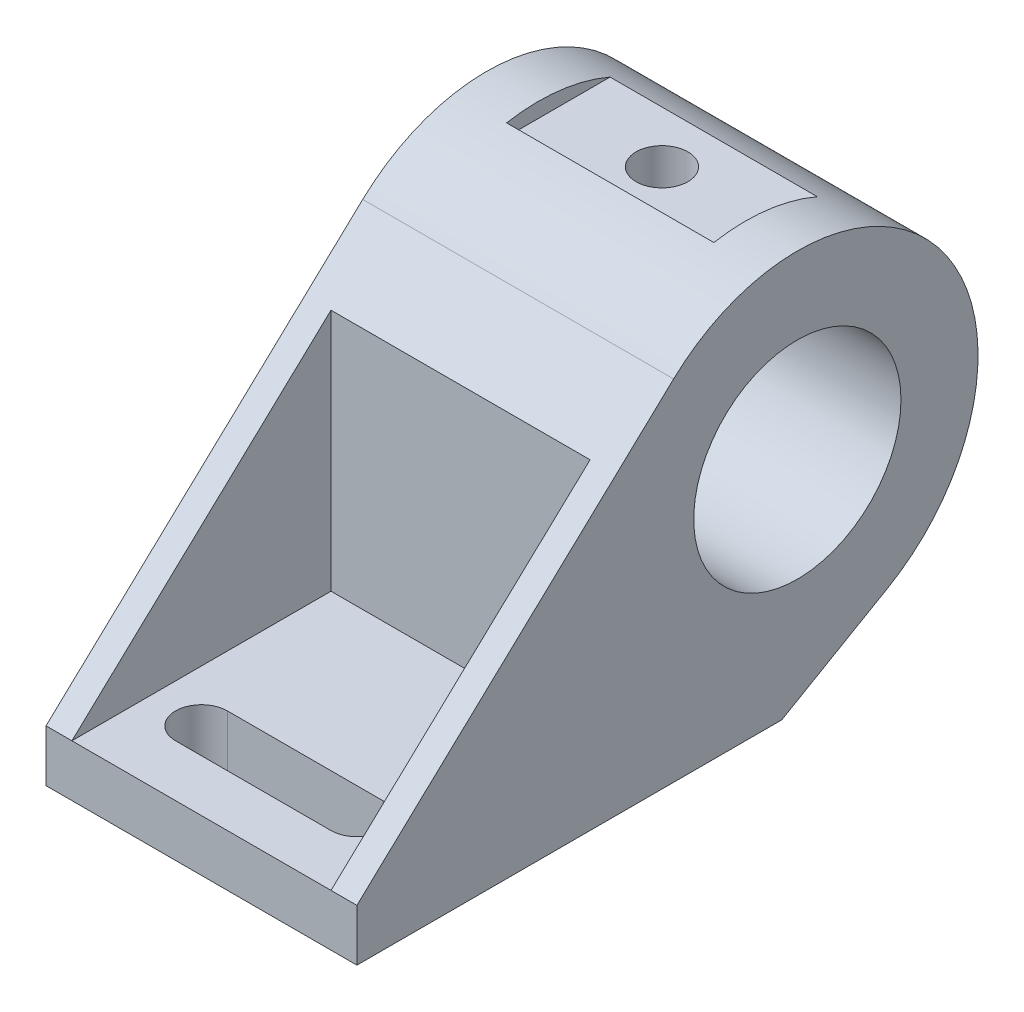
ISO-10303-21;
HEADER;
FILE_DESCRIPTION(('STEP AP214'),'2;1');
FILE_NAME('part.step','',(''),(''),'','','');
FILE_SCHEMA(('AUTOMOTIVE_DESIGN { 1 0 10303 214 1 1 1 1 }'));
ENDSEC;
DATA;
#1=APPLICATION_CONTEXT('core data for automotive mechanical design processes');
#2=APPLICATION_PROTOCOL_DEFINITION('international standard','automotive_design',2000,#1);
#3=PRODUCT_CONTEXT('',#1,'mechanical');
#4=PRODUCT('Part','Part','',(#3));
#5=PRODUCT_RELATED_PRODUCT_CATEGORY('part','',(#4));
#6=PRODUCT_DEFINITION_FORMATION('','',#4);
#7=PRODUCT_DEFINITION_CONTEXT('part definition',#1,'design');
#8=PRODUCT_DEFINITION('design','',#6,#7);
#9=PRODUCT_DEFINITION_SHAPE('','',#8);
#10=(LENGTH_UNIT() NAMED_UNIT(*) SI_UNIT(.MILLI.,.METRE.));
#11=(NAMED_UNIT(*) PLANE_ANGLE_UNIT() SI_UNIT($,.RADIAN.));
#12=(NAMED_UNIT(*) SI_UNIT($,.STERADIAN.) SOLID_ANGLE_UNIT());
#13=UNCERTAINTY_MEASURE_WITH_UNIT(LENGTH_MEASURE(1.E-05),#10,'distance_accuracy_value','');
#14=(GEOMETRIC_REPRESENTATION_CONTEXT(3) GLOBAL_UNCERTAINTY_ASSIGNED_CONTEXT((#13)) GLOBAL_UNIT_ASSIGNED_CONTEXT((#10,
#11,#12)) REPRESENTATION_CONTEXT('',''));
#15=CARTESIAN_POINT('',(0.,0.,0.));
#16=DIRECTION('',(0.,0.,1.));
#17=DIRECTION('',(1.,0.,0.));
#18=AXIS2_PLACEMENT_3D('',#15,#16,#17);
#19=CARTESIAN_POINT('',(30.,10.,41.));
#20=DIRECTION('',(-1.,0.,0.));
#21=DIRECTION('',(0.,0.,1.));
#22=AXIS2_PLACEMENT_3D('',#19,#20,#21);
#23=PLANE('',#22);
#24=DIRECTION('',(0.,0.,-1.));
#25=VECTOR('',#24,1.);
#26=CARTESIAN_POINT('',(30.,0.,41.));
#27=LINE('',#26,#25);
#28=CARTESIAN_POINT('',(30.,0.,41.));
#29=VERTEX_POINT('',#28);
#30=CARTESIAN_POINT('',(30.,0.,-41.));
#31=VERTEX_POINT('',#30);
#32=EDGE_CURVE('E244',#29,#31,#27,.T.);
#33=ORIENTED_EDGE('',*,*,#32,.T.);
#34=DIRECTION('',(0.,0.500000000000001,-0.866025403784438));
#35=VECTOR('',#34,1.);
#36=CARTESIAN_POINT('',(30.,-17.753520777581,-10.25));
#37=LINE('',#36,#35);
#38=CARTESIAN_POINT('',(30.,11.7990381056767,-61.4365334794732));
#39=VERTEX_POINT('',#38);
#40=EDGE_CURVE('E234',#31,#39,#37,.T.);
#41=ORIENTED_EDGE('',*,*,#40,.T.);
#42=CARTESIAN_POINT('',(30.,42.,-44.));
#43=DIRECTION('',(1.,0.,0.));
#44=DIRECTION('',(0.,0.,-1.));
#45=AXIS2_PLACEMENT_3D('',#42,#43,#44);
#46=CIRCLE('',#45,34.8730669589464);
#47=CARTESIAN_POINT('',(30.,67.4175118315234,-20.123633203154));
#48=VERTEX_POINT('',#47);
#49=EDGE_CURVE('E237',#39,#48,#46,.T.);
#50=ORIENTED_EDGE('',*,*,#49,.T.);
#51=DIRECTION('',(0.,0.684664954331488,-0.72885794247594));
#52=VECTOR('',#51,1.);
#53=CARTESIAN_POINT('',(30.,25.7723020889793,24.2096449862736));
#54=LINE('',#53,#52);
#55=CARTESIAN_POINT('',(30.,10.,41.));
#56=VERTEX_POINT('',#55);
#57=EDGE_CURVE('E223',#56,#48,#54,.T.);
#58=ORIENTED_EDGE('',*,*,#57,.F.);
#59=DIRECTION('',(0.,-1.,0.));
#60=VECTOR('',#59,1.);
#61=CARTESIAN_POINT('',(30.,10.,41.));
#62=LINE('',#61,#60);
#63=EDGE_CURVE('E249',#56,#29,#62,.T.);
#64=ORIENTED_EDGE('',*,*,#63,.T.);
#65=EDGE_LOOP('',(#33,#41,#50,#58,#64));
#66=FACE_BOUND('',#65,.T.);
#67=CARTESIAN_POINT('',(30.,42.,-44.));
#68=DIRECTION('',(1.,0.,0.));
#69=DIRECTION('',(0.,0.,-1.));
#70=AXIS2_PLACEMENT_3D('',#67,#68,#69);
#71=CIRCLE('',#70,20.);
#72=CARTESIAN_POINT('',(30.,42.,-64.));
#73=VERTEX_POINT('',#72);
#74=EDGE_CURVE('E216',#73,#73,#71,.T.);
#75=ORIENTED_EDGE('',*,*,#74,.F.);
#76=EDGE_LOOP('',(#75));
#77=FACE_BOUND('',#76,.T.);
#78=ADVANCED_FACE('F47',(#66,#77),#23,.F.);
#79=CARTESIAN_POINT('',(-30.,10.,41.));
#80=DIRECTION('',(1.,0.,0.));
#81=DIRECTION('',(0.,0.,-1.));
#82=AXIS2_PLACEMENT_3D('',#79,#80,#81);
#83=PLANE('',#82);
#84=DIRECTION('',(0.,0.500000000000001,-0.866025403784438));
#85=VECTOR('',#84,1.);
#86=CARTESIAN_POINT('',(-30.,-17.753520777581,-10.25));
#87=LINE('',#86,#85);
#88=CARTESIAN_POINT('',(-30.,0.,-41.));
#89=VERTEX_POINT('',#88);
#90=CARTESIAN_POINT('',(-30.,11.7990381056767,-61.4365334794732));
#91=VERTEX_POINT('',#90);
#92=EDGE_CURVE('E222',#89,#91,#87,.T.);
#93=ORIENTED_EDGE('',*,*,#92,.F.);
#94=DIRECTION('',(0.,0.,1.));
#95=VECTOR('',#94,1.);
#96=CARTESIAN_POINT('',(-30.,0.,41.));
#97=LINE('',#96,#95);
#98=CARTESIAN_POINT('',(-30.,0.,41.));
#99=VERTEX_POINT('',#98);
#100=EDGE_CURVE('E256',#89,#99,#97,.T.);
#101=ORIENTED_EDGE('',*,*,#100,.T.);
#102=DIRECTION('',(0.,-1.,0.));
#103=VECTOR('',#102,1.);
#104=CARTESIAN_POINT('',(-30.,10.,41.));
#105=LINE('',#104,#103);
#106=CARTESIAN_POINT('',(-30.,10.,41.));
#107=VERTEX_POINT('',#106);
#108=EDGE_CURVE('E262',#107,#99,#105,.T.);
#109=ORIENTED_EDGE('',*,*,#108,.F.);
#110=DIRECTION('',(0.,0.684664954331488,-0.72885794247594));
#111=VECTOR('',#110,1.);
#112=CARTESIAN_POINT('',(-30.,25.7723020889793,24.2096449862736));
#113=LINE('',#112,#111);
#114=CARTESIAN_POINT('',(-30.,67.4175118315234,-20.123633203154));
#115=VERTEX_POINT('',#114);
#116=EDGE_CURVE('E229',#107,#115,#113,.T.);
#117=ORIENTED_EDGE('',*,*,#116,.T.);
#118=CARTESIAN_POINT('',(-30.,42.,-44.));
#119=DIRECTION('',(1.,0.,0.));
#120=DIRECTION('',(0.,0.,-1.));
#121=AXIS2_PLACEMENT_3D('',#118,#119,#120);
#122=CIRCLE('',#121,34.8730669589464);
#123=EDGE_CURVE('E226',#91,#115,#122,.T.);
#124=ORIENTED_EDGE('',*,*,#123,.F.);
#125=EDGE_LOOP('',(#93,#101,#109,#117,#124));
#126=FACE_BOUND('',#125,.T.);
#127=CARTESIAN_POINT('',(-30.,42.,-44.));
#128=DIRECTION('',(1.,0.,0.));
#129=DIRECTION('',(0.,0.,-1.));
#130=AXIS2_PLACEMENT_3D('',#127,#128,#129);
#131=CIRCLE('',#130,20.);
#132=CARTESIAN_POINT('',(-30.,42.,-64.));
#133=VERTEX_POINT('',#132);
#134=EDGE_CURVE('E219',#133,#133,#131,.T.);
#135=ORIENTED_EDGE('',*,*,#134,.T.);
#136=EDGE_LOOP('',(#135));
#137=FACE_BOUND('',#136,.T.);
#138=ADVANCED_FACE('F297',(#126,#137),#83,.F.);
#139=CARTESIAN_POINT('',(-30.,10.,41.));
#140=DIRECTION('',(0.,0.,-1.));
#141=DIRECTION('',(-1.,0.,0.));
#142=AXIS2_PLACEMENT_3D('',#139,#140,#141);
#143=PLANE('',#142);
#144=DIRECTION('',(1.,0.,0.));
#145=VECTOR('',#144,1.);
#146=CARTESIAN_POINT('',(-30.,0.,41.));
#147=LINE('',#146,#145);
#148=EDGE_CURVE('E258',#99,#29,#147,.T.);
#149=ORIENTED_EDGE('',*,*,#148,.T.);
#150=ORIENTED_EDGE('',*,*,#63,.F.);
#151=DIRECTION('',(1.,0.,0.));
#152=VECTOR('',#151,1.);
#153=CARTESIAN_POINT('',(-30.,10.,41.));
#154=LINE('',#153,#152);
#155=CARTESIAN_POINT('',(25.,9.99999999999999,41.));
#156=VERTEX_POINT('',#155);
#157=EDGE_CURVE('E250',#156,#56,#154,.T.);
#158=ORIENTED_EDGE('',*,*,#157,.F.);
#159=DIRECTION('',(1.,0.,0.));
#160=VECTOR('',#159,1.);
#161=CARTESIAN_POINT('',(-25.,9.99999999999999,41.));
#162=LINE('',#161,#160);
#163=CARTESIAN_POINT('',(-25.,10.,41.));
#164=VERTEX_POINT('',#163);
#165=EDGE_CURVE('E203',#164,#156,#162,.T.);
#166=ORIENTED_EDGE('',*,*,#165,.F.);
#167=EDGE_CURVE('E246',#107,#164,#154,.T.);
#168=ORIENTED_EDGE('',*,*,#167,.F.);
#169=ORIENTED_EDGE('',*,*,#108,.T.);
#170=EDGE_LOOP('',(#149,#150,#158,#166,#168,#169));
#171=FACE_BOUND('',#170,.T.);
#172=ADVANCED_FACE('F309',(#171),#143,.F.);
#173=CARTESIAN_POINT('',(0.,0.,0.));
#174=DIRECTION('',(0.,-1.,0.));
#175=DIRECTION('',(0.,0.,-1.));
#176=AXIS2_PLACEMENT_3D('',#173,#174,#175);
#177=PLANE('',#176);
#178=CARTESIAN_POINT('',(-15.,0.,26.));
#179=DIRECTION('',(0.,-1.,0.));
#180=DIRECTION('',(0.,0.,-1.));
#181=AXIS2_PLACEMENT_3D('',#178,#179,#180);
#182=CIRCLE('',#181,5.);
#183=CARTESIAN_POINT('',(-15.,0.,31.));
#184=VERTEX_POINT('',#183);
#185=CARTESIAN_POINT('',(-15.,0.,21.));
#186=VERTEX_POINT('',#185);
#187=EDGE_CURVE('E199',#184,#186,#182,.T.);
#188=ORIENTED_EDGE('',*,*,#187,.F.);
#189=DIRECTION('',(-1.,0.,0.));
#190=VECTOR('',#189,1.);
#191=CARTESIAN_POINT('',(0.,0.,31.));
#192=LINE('',#191,#190);
#193=CARTESIAN_POINT('',(15.,0.,31.));
#194=VERTEX_POINT('',#193);
#195=EDGE_CURVE('E188',#194,#184,#192,.T.);
#196=ORIENTED_EDGE('',*,*,#195,.F.);
#197=CARTESIAN_POINT('',(15.,0.,26.));
#198=DIRECTION('',(0.,-1.,0.));
#199=DIRECTION('',(0.,0.,-1.));
#200=AXIS2_PLACEMENT_3D('',#197,#198,#199);
#201=CIRCLE('',#200,5.);
#202=CARTESIAN_POINT('',(15.,0.,21.));
#203=VERTEX_POINT('',#202);
#204=EDGE_CURVE('E195',#203,#194,#201,.T.);
#205=ORIENTED_EDGE('',*,*,#204,.F.);
#206=DIRECTION('',(1.,0.,0.));
#207=VECTOR('',#206,1.);
#208=CARTESIAN_POINT('',(0.,0.,21.));
#209=LINE('',#208,#207);
#210=EDGE_CURVE('E197',#186,#203,#209,.T.);
#211=ORIENTED_EDGE('',*,*,#210,.F.);
#212=EDGE_LOOP('',(#188,#196,#205,#211));
#213=FACE_BOUND('',#212,.T.);
#214=ORIENTED_EDGE('',*,*,#32,.F.);
#215=ORIENTED_EDGE('',*,*,#148,.F.);
#216=ORIENTED_EDGE('',*,*,#100,.F.);
#217=DIRECTION('',(-1.,0.,0.));
#218=VECTOR('',#217,1.);
#219=CARTESIAN_POINT('',(-30.,0.,-41.));
#220=LINE('',#219,#218);
#221=EDGE_CURVE('E253',#31,#89,#220,.T.);
#222=ORIENTED_EDGE('',*,*,#221,.F.);
#223=EDGE_LOOP('',(#214,#215,#216,#222));
#224=FACE_BOUND('',#223,.T.);
#225=ADVANCED_FACE('F308',(#213,#224),#177,.T.);
#226=CARTESIAN_POINT('',(-30.,-17.753520777581,-10.25));
#227=DIRECTION('',(0.,-0.866025403784438,-0.500000000000001));
#228=DIRECTION('',(0.,0.500000000000001,-0.866025403784438));
#229=AXIS2_PLACEMENT_3D('',#226,#227,#228);
#230=PLANE('',#229);
#231=ORIENTED_EDGE('',*,*,#40,.F.);
#232=ORIENTED_EDGE('',*,*,#221,.T.);
#233=ORIENTED_EDGE('',*,*,#92,.T.);
#234=DIRECTION('',(1.,0.,0.));
#235=VECTOR('',#234,1.);
#236=CARTESIAN_POINT('',(-30.,11.7990381056767,-61.4365334794732));
#237=LINE('',#236,#235);
#238=EDGE_CURVE('E231',#91,#39,#237,.T.);
#239=ORIENTED_EDGE('',*,*,#238,.T.);
#240=EDGE_LOOP('',(#231,#232,#233,#239));
#241=FACE_BOUND('',#240,.T.);
#242=ADVANCED_FACE('F294',(#241),#230,.T.);
#243=CARTESIAN_POINT('',(-30.,25.7723020889793,24.2096449862736));
#244=DIRECTION('',(0.,-0.72885794247594,-0.684664954331488));
#245=DIRECTION('',(0.,0.684664954331488,-0.72885794247594));
#246=AXIS2_PLACEMENT_3D('',#243,#244,#245);
#247=PLANE('',#246);
#248=ORIENTED_EDGE('',*,*,#167,.T.);
#249=DIRECTION('',(0.,0.684664954331488,-0.72885794247594));
#250=VECTOR('',#249,1.);
#251=CARTESIAN_POINT('',(-25.,25.7723020889793,24.2096449862736));
#252=LINE('',#251,#250);
#253=CARTESIAN_POINT('',(-25.,56.9683400859756,-8.99999999999999));
#254=VERTEX_POINT('',#253);
#255=EDGE_CURVE('E271',#164,#254,#252,.T.);
#256=ORIENTED_EDGE('',*,*,#255,.T.);
#257=DIRECTION('',(1.,0.,0.));
#258=VECTOR('',#257,1.);
#259=CARTESIAN_POINT('',(-30.,56.9683400859756,-8.99999999999999));
#260=LINE('',#259,#258);
#261=CARTESIAN_POINT('',(25.,56.9683400859756,-9.));
#262=VERTEX_POINT('',#261);
#263=EDGE_CURVE('E268',#254,#262,#260,.T.);
#264=ORIENTED_EDGE('',*,*,#263,.T.);
#265=DIRECTION('',(0.,-0.684664954331488,0.72885794247594));
#266=VECTOR('',#265,1.);
#267=CARTESIAN_POINT('',(25.,25.7723020889793,24.2096449862736));
#268=LINE('',#267,#266);
#269=EDGE_CURVE('E265',#262,#156,#268,.T.);
#270=ORIENTED_EDGE('',*,*,#269,.T.);
#271=ORIENTED_EDGE('',*,*,#157,.T.);
#272=ORIENTED_EDGE('',*,*,#57,.T.);
#273=DIRECTION('',(1.,0.,0.));
#274=VECTOR('',#273,1.);
#275=CARTESIAN_POINT('',(-30.,67.4175118315234,-20.123633203154));
#276=LINE('',#275,#274);
#277=EDGE_CURVE('E242',#115,#48,#276,.T.);
#278=ORIENTED_EDGE('',*,*,#277,.F.);
#279=ORIENTED_EDGE('',*,*,#116,.F.);
#280=EDGE_LOOP('',(#248,#256,#264,#270,#271,#272,#278,#279));
#281=FACE_BOUND('',#280,.T.);
#282=ADVANCED_FACE('F302',(#281),#247,.F.);
#283=CARTESIAN_POINT('',(-30.,42.,-44.));
#284=DIRECTION('',(1.,0.,0.));
#285=DIRECTION('',(0.,0.,-1.));
#286=AXIS2_PLACEMENT_3D('',#283,#284,#285);
#287=CYLINDRICAL_SURFACE('',#286,20.);
#288=CARTESIAN_POINT('',(0.,61.9683250672799,-42.8748360086451));
#289=CARTESIAN_POINT('',(-0.280919694586238,61.9683292922809,-42.8748477461033));
#290=CARTESIAN_POINT('',(-0.56194644347248,61.9697064901629,-42.8985814912696));
#291=CARTESIAN_POINT('',(-1.11610694894183,61.974681142184,-42.9928890215304));
#292=CARTESIAN_POINT('',(-1.3892362600569,61.9782798222711,-43.0634886716806));
#293=CARTESIAN_POINT('',(-1.9197024590713,61.9861294059561,-43.2495036027304));
#294=CARTESIAN_POINT('',(-2.1770435562266,61.9903801346459,-43.364906877993));
#295=CARTESIAN_POINT('',(-2.66870580102368,61.9971722319961,-43.6372676019227));
#296=CARTESIAN_POINT('',(-2.90302890547328,61.9997137460681,-43.7942215140841));
#297=CARTESIAN_POINT('',(-3.34201308666248,62.0002404366171,-44.1452360043947));
#298=CARTESIAN_POINT('',(-3.54667562628035,61.998225837886,-44.3392947514137));
#299=CARTESIAN_POINT('',(-3.92043423322227,61.9866961738599,-44.7588909395678));
#300=CARTESIAN_POINT('',(-4.08953328833862,61.9771817389672,-44.9844257336576));
#301=CARTESIAN_POINT('',(-4.38572483543892,61.9481988083931,-45.4577036887874));
#302=CARTESIAN_POINT('',(-4.51323880014234,61.9288356277117,-45.7051894643062));
#303=CARTESIAN_POINT('',(-4.72521350459567,61.8784230090553,-46.2168202094046));
#304=CARTESIAN_POINT('',(-4.80967892888781,61.84737484328,-46.4809633628114));
#305=CARTESIAN_POINT('',(-4.93305616667046,61.7732535713669,-47.0150181302385));
#306=CARTESIAN_POINT('',(-4.97244046038295,61.7303111580782,-47.2848391524793));
#307=CARTESIAN_POINT('',(-5.00707979156628,61.6327152411535,-47.8251645533715));
#308=CARTESIAN_POINT('',(-5.00233118595594,61.5780607710749,-48.0956689865943));
#309=CARTESIAN_POINT('',(-4.94942410800721,61.4574786090304,-48.6351208924258));
#310=CARTESIAN_POINT('',(-4.90045962609845,61.3913600944823,-48.9039457603308));
#311=CARTESIAN_POINT('',(-4.76033080405764,61.2511933078777,-49.4281918011179));
#312=CARTESIAN_POINT('',(-4.66915571501867,61.1771430196935,-49.6836095414263));
#313=CARTESIAN_POINT('',(-4.44200864370298,61.0206989951972,-50.1875754810561));
#314=CARTESIAN_POINT('',(-4.30402781657038,60.9380732932638,-50.4351444380977));
#315=CARTESIAN_POINT('',(-3.98827113276267,60.7723733137816,-50.9036042553462));
#316=CARTESIAN_POINT('',(-3.81048044040516,60.6892988802992,-51.1244851225088));
#317=CARTESIAN_POINT('',(-3.51369992415176,60.5669706047181,-51.4350974403566));
#318=CARTESIAN_POINT('',(-3.40765121542898,60.525888366053,-51.5367428948975));
#319=CARTESIAN_POINT('',(-3.18658518329725,60.4458153872069,-51.7306446224658));
#320=CARTESIAN_POINT('',(-3.07157152670624,60.4068238028127,-51.8229046990506));
#321=CARTESIAN_POINT('',(-2.83318374977257,60.3317173109674,-51.9973227596824));
#322=CARTESIAN_POINT('',(-2.70980687845297,60.2956033586594,-52.0794773944115));
#323=CARTESIAN_POINT('',(-2.45553411794996,60.2270967329699,-52.232860819967));
#324=CARTESIAN_POINT('',(-2.32464210276513,60.194702167655,-52.3040951718292));
#325=CARTESIAN_POINT('',(-2.06154481419465,60.1356253734181,-52.4323115130328));
#326=CARTESIAN_POINT('',(-1.92960177687741,60.1087664086265,-52.4897498239741));
#327=CARTESIAN_POINT('',(-1.6605259810246,60.0598824912574,-52.5932486469921));
#328=CARTESIAN_POINT('',(-1.52339584312814,60.0378551348994,-52.6393148182765));
#329=CARTESIAN_POINT('',(-1.24501474322583,59.9992236433569,-52.7195144373643));
#330=CARTESIAN_POINT('',(-1.10376591594106,59.9826167513127,-52.7536539517144));
#331=CARTESIAN_POINT('',(-0.818283946504251,59.9552922399774,-52.8095660645177));
#332=CARTESIAN_POINT('',(-0.67405110802272,59.9445740244492,-52.8313399150198));
#333=CARTESIAN_POINT('',(-0.397953641916834,59.9300848633288,-52.8607163110656));
#334=CARTESIAN_POINT('',(-0.266241787236023,59.9257423185065,-52.8694856640827));
#335=CARTESIAN_POINT('',(-0.00242033572544825,59.9222320920147,-52.8765767349342));
#336=CARTESIAN_POINT('',(0.129689377024214,59.9230661020266,-52.8748950373986));
#337=CARTESIAN_POINT('',(0.393154171427112,59.9298905797869,-52.8610993574272));
#338=CARTESIAN_POINT('',(0.52450962521629,59.9358782361575,-52.8489910628272));
#339=CARTESIAN_POINT('',(0.785582560367472,59.9528574621053,-52.8144924550511));
#340=CARTESIAN_POINT('',(0.915299407620375,59.9638509113313,-52.7920982795533));
#341=CARTESIAN_POINT('',(1.16675996456796,59.9900187267278,-52.7384253814807));
#342=CARTESIAN_POINT('',(1.28861098265388,60.0050003386463,-52.7075545956068));
#343=CARTESIAN_POINT('',(1.5291473035783,60.038989421876,-52.6369200906038));
#344=CARTESIAN_POINT('',(1.64783149358301,60.0579982879347,-52.5971532902758));
#345=CARTESIAN_POINT('',(1.99801327198691,60.120498397402,-52.465050640507));
#346=CARTESIAN_POINT('',(2.22383351827508,60.1694841594188,-52.359870697001));
#347=CARTESIAN_POINT('',(2.66812585233637,60.2817467504781,-52.1115535629738));
#348=CARTESIAN_POINT('',(2.88536041673466,60.3457006857397,-51.9665296494234));
#349=CARTESIAN_POINT('',(3.29327293074907,60.4815853627652,-51.6459974449823));
#350=CARTESIAN_POINT('',(3.48393945837622,60.5535195116159,-51.4704761152207));
#351=CARTESIAN_POINT('',(3.85163008600774,60.7079135895737,-51.0755181526871));
#352=CARTESIAN_POINT('',(4.02575217709649,60.7907311704098,-50.8535191317706));
#353=CARTESIAN_POINT('',(4.33448696125783,60.9556907170243,-50.3830829469453));
#354=CARTESIAN_POINT('',(4.46908798410432,61.0378324762928,-50.1346380032363));
#355=CARTESIAN_POINT('',(4.64072363168229,61.1586157271782,-49.7417217126361));
#356=CARTESIAN_POINT('',(4.69358407009145,61.1992186111869,-49.6045591615034));
#357=CARTESIAN_POINT('',(4.7871540473876,61.2784535565569,-49.3256167104914));
#358=CARTESIAN_POINT('',(4.82786827768456,61.3170863740537,-49.1838386168708));
#359=CARTESIAN_POINT('',(4.89671751486405,61.3918911109522,-48.8965910405033));
#360=CARTESIAN_POINT('',(4.92484941218868,61.4280624201541,-48.7511206546313));
#361=CARTESIAN_POINT('',(4.96813120589652,61.4974916508449,-48.4576382345063));
#362=CARTESIAN_POINT('',(4.98328705822254,61.5307509026543,-48.3096273981643));
#363=CARTESIAN_POINT('',(5.00004488755237,61.5929499282167,-48.0172003063504));
#364=CARTESIAN_POINT('',(5.00208909183094,61.6219979381202,-47.8728323766091));
#365=CARTESIAN_POINT('',(4.99361933552148,61.6768204563143,-47.5839010105749));
#366=CARTESIAN_POINT('',(4.98311071462308,61.7025963513306,-47.4393376835208));
#367=CARTESIAN_POINT('',(4.94947316128659,61.7507414760871,-47.1511201367449));
#368=CARTESIAN_POINT('',(4.92634488683399,61.7731108833629,-47.0074658700201));
#369=CARTESIAN_POINT('',(4.86751935276058,61.8143916551845,-46.7222498961141));
#370=CARTESIAN_POINT('',(4.83182256543074,61.8333031496289,-46.5806881105114));
#371=CARTESIAN_POINT('',(4.75014252594316,61.8668491443321,-46.3078655568873));
#372=CARTESIAN_POINT('',(4.70476381571701,61.8816503836181,-46.1764439148557));
#373=CARTESIAN_POINT('',(4.60307712427121,61.9082898302356,-45.9175343191328));
#374=CARTESIAN_POINT('',(4.54676542529788,61.9201270265027,-45.7900477206895));
#375=CARTESIAN_POINT('',(4.4236185608616,61.9410085364325,-45.5400981744359));
#376=CARTESIAN_POINT('',(4.35678817398937,61.9500541128168,-45.4176329771175));
#377=CARTESIAN_POINT('',(4.21301963790648,61.9656045456201,-45.1785553572989));
#378=CARTESIAN_POINT('',(4.13607775437966,61.9721084598241,-45.0619451192141));
#379=CARTESIAN_POINT('',(3.97391394128143,61.982779196778,-44.8372534726308));
#380=CARTESIAN_POINT('',(3.88883800915406,61.986980515848,-44.7290682655522));
#381=CARTESIAN_POINT('',(3.70999536446503,61.9935123005523,-44.5200090587535));
#382=CARTESIAN_POINT('',(3.61622550219497,61.9958420851742,-44.4191377325372));
#383=CARTESIAN_POINT('',(3.42069437928011,61.9989633846449,-44.2254826605596));
#384=CARTESIAN_POINT('',(3.31893482838198,61.9997552276758,-44.1326971933902));
#385=CARTESIAN_POINT('',(3.10807204256588,62.000146872888,-43.9558011093988));
#386=CARTESIAN_POINT('',(2.99896612775128,61.9997462377345,-43.8716936869043));
#387=CARTESIAN_POINT('',(2.77284976622854,61.9980854536707,-43.7118198724221));
#388=CARTESIAN_POINT('',(2.65576052601911,61.9968151044266,-43.6361650003566));
#389=CARTESIAN_POINT('',(2.41563598907421,61.9937449875375,-43.4948680645359));
#390=CARTESIAN_POINT('',(2.29259835714523,61.9919450105398,-43.4292299758524));
#391=CARTESIAN_POINT('',(2.04157069219043,61.9881336697413,-43.3085066956631));
#392=CARTESIAN_POINT('',(1.91358480619255,61.9861224806264,-43.2534128881714));
#393=CARTESIAN_POINT('',(1.65345532193551,61.9821641448841,-43.1540846105262));
#394=CARTESIAN_POINT('',(1.52131066360242,61.9802170148484,-43.1098529348486));
#395=CARTESIAN_POINT('',(1.16245875150588,61.9754031296101,-43.0062149131858));
#396=CARTESIAN_POINT('',(0.932702834351882,61.9728144289628,-42.9570217843133));
#397=CARTESIAN_POINT('',(0.468656115126311,61.9692736354783,-42.8913274377793));
#398=CARTESIAN_POINT('',(0.234365313579633,61.9683215424516,-42.8748262163339));
#399=CARTESIAN_POINT('',(0.,61.9683250672799,-42.8748360086451));
#400=B_SPLINE_CURVE_WITH_KNOTS('',3,(#288,#289,#290,#291,#292,#293,#294,#295,#296,#297,#298,
#299,#300,#301,#302,#303,#304,#305,#306,#307,#308,#309,#310,#311,#312,#313,#314,#315,#316,#317,
#318,#319,#320,#321,#322,#323,#324,#325,#326,#327,#328,#329,#330,#331,#332,#333,#334,#335,#336,
#337,#338,#339,#340,#341,#342,#343,#344,#345,#346,#347,#348,#349,#350,#351,#352,#353,#354,#355,
#356,#357,#358,#359,#360,#361,#362,#363,#364,#365,#366,#367,#368,#369,#370,#371,#372,#373,#374,
#375,#376,#377,#378,#379,#380,#381,#382,#383,#384,#385,#386,#387,#388,#389,#390,#391,#392,#393,
#394,#395,#396,#397,#398,#399),.UNSPECIFIED.,.T.,.F.,(4,2,2,2,2,2,2,2,2,2,2,2,2,2,2,2,2,2,2,2,2,
2,2,2,2,2,2,2,2,2,2,2,2,2,2,2,2,2,2,2,2,2,2,2,2,2,2,2,2,2,2,2,2,2,2,4),(0.,0.84194848268131,
1.68436201921408,2.52654997716245,3.36866627687389,4.21074102871898,5.05274500711695,
5.88592880842309,6.71902192329745,7.54330133606527,8.36764879202846,9.20733347477377,
10.0472321004553,10.9290535912705,11.8112042532937,12.2683300245441,12.7252697948313,
13.1823606061412,13.6392178701056,14.0777900490427,14.5161435358797,14.9542737265203,
15.3923595476651,15.7880803954117,16.1839305702649,16.579564940725,16.9753479924736,
17.3546817498965,17.734147096291,18.4924875570387,19.2959680599431,20.0997929321369,
20.9781143714438,21.8566949111565,22.3137239860913,22.770576306684,23.2275414700099,
23.6842967758876,24.1255619451233,24.5666394768995,25.0076940132044,25.4487319776326,
25.8676869606429,26.2867846592598,26.705692510395,27.1247555070833,27.5373556015849,
27.950105764728,28.3627678412297,28.7755812778831,29.1933212083521,29.6112264865136,
30.0287888124713,30.4464584514596,31.1488782062995,31.8512978798369),.UNSPECIFIED.);
#401=CARTESIAN_POINT('',(0.,61.9683250672799,-42.8748360086451));
#402=VERTEX_POINT('',#401);
#403=EDGE_CURVE('E646',#402,#402,#400,.T.);
#404=ORIENTED_EDGE('',*,*,#403,.F.);
#405=EDGE_LOOP('',(#404));
#406=FACE_BOUND('',#405,.T.);
#407=ORIENTED_EDGE('',*,*,#134,.F.);
#408=EDGE_LOOP('',(#407));
#409=FACE_BOUND('',#408,.T.);
#410=ORIENTED_EDGE('',*,*,#74,.T.);
#411=EDGE_LOOP('',(#410));
#412=FACE_BOUND('',#411,.T.);
#413=ADVANCED_FACE('F283',(#406,#409,#412),#287,.F.);
#414=CARTESIAN_POINT('',(-30.,42.,-44.));
#415=DIRECTION('',(1.,0.,0.));
#416=DIRECTION('',(0.,0.,-1.));
#417=AXIS2_PLACEMENT_3D('',#414,#415,#416);
#418=CYLINDRICAL_SURFACE('',#417,34.8730669589464);
#419=CARTESIAN_POINT('',(20.,42.,-44.));
#420=DIRECTION('',(1.,0.,0.));
#421=DIRECTION('',(0.,0.,-1.));
#422=AXIS2_PLACEMENT_3D('',#419,#420,#421);
#423=CIRCLE('',#422,34.8730669589464);
#424=CARTESIAN_POINT('',(20.,76.333379325291,-37.8885465534918));
#425=VERTEX_POINT('',#424);
#426=CARTESIAN_POINT('',(20.,74.,-57.8611254637984));
#427=VERTEX_POINT('',#426);
#428=EDGE_CURVE('E11',#425,#427,#423,.F.);
#429=ORIENTED_EDGE('',*,*,#428,.F.);
#430=DIRECTION('',(1.,0.,0.));
#431=VECTOR('',#430,1.);
#432=CARTESIAN_POINT('',(-30.,76.333379325291,-37.8885465534918));
#433=LINE('',#432,#431);
#434=CARTESIAN_POINT('',(-20.,76.333379325291,-37.8885465534918));
#435=VERTEX_POINT('',#434);
#436=EDGE_CURVE('E54',#435,#425,#433,.T.);
#437=ORIENTED_EDGE('',*,*,#436,.F.);
#438=CARTESIAN_POINT('',(-20.,42.,-44.));
#439=DIRECTION('',(-1.,0.,0.));
#440=DIRECTION('',(0.,0.,1.));
#441=AXIS2_PLACEMENT_3D('',#438,#439,#440);
#442=CIRCLE('',#441,34.8730669589464);
#443=CARTESIAN_POINT('',(-20.,74.,-57.8611254637984));
#444=VERTEX_POINT('',#443);
#445=EDGE_CURVE('E164',#444,#435,#442,.F.);
#446=ORIENTED_EDGE('',*,*,#445,.F.);
#447=DIRECTION('',(1.,0.,0.));
#448=VECTOR('',#447,1.);
#449=CARTESIAN_POINT('',(-30.,74.,-57.8611254637984));
#450=LINE('',#449,#448);
#451=EDGE_CURVE('E157',#427,#444,#450,.F.);
#452=ORIENTED_EDGE('',*,*,#451,.F.);
#453=EDGE_LOOP('',(#429,#437,#446,#452));
#454=FACE_BOUND('',#453,.T.);
#455=ORIENTED_EDGE('',*,*,#49,.F.);
#456=ORIENTED_EDGE('',*,*,#238,.F.);
#457=ORIENTED_EDGE('',*,*,#123,.T.);
#458=ORIENTED_EDGE('',*,*,#277,.T.);
#459=EDGE_LOOP('',(#455,#456,#457,#458));
#460=FACE_BOUND('',#459,.T.);
#461=ADVANCED_FACE('F279',(#454,#460),#418,.T.);
#462=CARTESIAN_POINT('',(-25.,9.99999999999999,41.));
#463=DIRECTION('',(-1.,0.,0.));
#464=DIRECTION('',(0.,0.,1.));
#465=AXIS2_PLACEMENT_3D('',#462,#463,#464);
#466=PLANE('',#465);
#467=DIRECTION('',(0.,0.,1.));
#468=VECTOR('',#467,1.);
#469=CARTESIAN_POINT('',(-25.,9.99999999999999,41.));
#470=LINE('',#469,#468);
#471=CARTESIAN_POINT('',(-25.,9.99999999999999,-8.99999999999999));
#472=VERTEX_POINT('',#471);
#473=EDGE_CURVE('E201',#472,#164,#470,.T.);
#474=ORIENTED_EDGE('',*,*,#473,.F.);
#475=DIRECTION('',(0.,1.,0.));
#476=VECTOR('',#475,1.);
#477=CARTESIAN_POINT('',(-25.,9.99999999999999,-8.99999999999999));
#478=LINE('',#477,#476);
#479=EDGE_CURVE('E213',#472,#254,#478,.T.);
#480=ORIENTED_EDGE('',*,*,#479,.T.);
#481=ORIENTED_EDGE('',*,*,#255,.F.);
#482=EDGE_LOOP('',(#474,#480,#481));
#483=FACE_BOUND('',#482,.T.);
#484=ADVANCED_FACE('F282',(#483),#466,.F.);
#485=CARTESIAN_POINT('',(-25.,9.99999999999999,-8.99999999999999));
#486=DIRECTION('',(0.,0.,-1.));
#487=DIRECTION('',(-1.,0.,0.));
#488=AXIS2_PLACEMENT_3D('',#485,#486,#487);
#489=PLANE('',#488);
#490=ORIENTED_EDGE('',*,*,#479,.F.);
#491=DIRECTION('',(-1.,0.,0.));
#492=VECTOR('',#491,1.);
#493=CARTESIAN_POINT('',(-25.,9.99999999999999,-8.99999999999999));
#494=LINE('',#493,#492);
#495=CARTESIAN_POINT('',(25.,9.99999999999999,-8.99999999999999));
#496=VERTEX_POINT('',#495);
#497=EDGE_CURVE('E209',#496,#472,#494,.T.);
#498=ORIENTED_EDGE('',*,*,#497,.F.);
#499=DIRECTION('',(0.,1.,0.));
#500=VECTOR('',#499,1.);
#501=CARTESIAN_POINT('',(25.,9.99999999999999,-8.99999999999999));
#502=LINE('',#501,#500);
#503=EDGE_CURVE('E212',#496,#262,#502,.T.);
#504=ORIENTED_EDGE('',*,*,#503,.T.);
#505=ORIENTED_EDGE('',*,*,#263,.F.);
#506=EDGE_LOOP('',(#490,#498,#504,#505));
#507=FACE_BOUND('',#506,.T.);
#508=ADVANCED_FACE('F316',(#507),#489,.F.);
#509=CARTESIAN_POINT('',(25.,9.99999999999999,41.));
#510=DIRECTION('',(1.,0.,0.));
#511=DIRECTION('',(0.,0.,-1.));
#512=AXIS2_PLACEMENT_3D('',#509,#510,#511);
#513=PLANE('',#512);
#514=ORIENTED_EDGE('',*,*,#503,.F.);
#515=DIRECTION('',(0.,0.,-1.));
#516=VECTOR('',#515,1.);
#517=CARTESIAN_POINT('',(25.,9.99999999999999,41.));
#518=LINE('',#517,#516);
#519=EDGE_CURVE('E206',#156,#496,#518,.T.);
#520=ORIENTED_EDGE('',*,*,#519,.F.);
#521=ORIENTED_EDGE('',*,*,#269,.F.);
#522=EDGE_LOOP('',(#514,#520,#521));
#523=FACE_BOUND('',#522,.T.);
#524=ADVANCED_FACE('F318',(#523),#513,.F.);
#525=CARTESIAN_POINT('',(0.,9.99999999999999,0.));
#526=DIRECTION('',(0.,-1.,0.));
#527=DIRECTION('',(0.,0.,-1.));
#528=AXIS2_PLACEMENT_3D('',#525,#526,#527);
#529=PLANE('',#528);
#530=DIRECTION('',(1.,0.,0.));
#531=VECTOR('',#530,1.);
#532=CARTESIAN_POINT('',(-15.,9.99999999999999,31.));
#533=LINE('',#532,#531);
#534=CARTESIAN_POINT('',(-15.,9.99999999999999,31.));
#535=VERTEX_POINT('',#534);
#536=CARTESIAN_POINT('',(15.,9.99999999999999,31.));
#537=VERTEX_POINT('',#536);
#538=EDGE_CURVE('E177',#535,#537,#533,.T.);
#539=ORIENTED_EDGE('',*,*,#538,.F.);
#540=CARTESIAN_POINT('',(-15.,9.99999999999999,26.));
#541=DIRECTION('',(0.,1.,0.));
#542=DIRECTION('',(0.,0.,1.));
#543=AXIS2_PLACEMENT_3D('',#540,#541,#542);
#544=CIRCLE('',#543,5.);
#545=CARTESIAN_POINT('',(-15.,9.99999999999999,21.));
#546=VERTEX_POINT('',#545);
#547=EDGE_CURVE('E174',#546,#535,#544,.T.);
#548=ORIENTED_EDGE('',*,*,#547,.F.);
#549=DIRECTION('',(-1.,0.,0.));
#550=VECTOR('',#549,1.);
#551=CARTESIAN_POINT('',(-15.,9.99999999999999,21.));
#552=LINE('',#551,#550);
#553=CARTESIAN_POINT('',(15.,9.99999999999999,21.));
#554=VERTEX_POINT('',#553);
#555=EDGE_CURVE('E182',#554,#546,#552,.T.);
#556=ORIENTED_EDGE('',*,*,#555,.F.);
#557=CARTESIAN_POINT('',(15.,9.99999999999999,26.));
#558=DIRECTION('',(0.,1.,0.));
#559=DIRECTION('',(0.,0.,1.));
#560=AXIS2_PLACEMENT_3D('',#557,#558,#559);
#561=CIRCLE('',#560,5.);
#562=EDGE_CURVE('E179',#537,#554,#561,.T.);
#563=ORIENTED_EDGE('',*,*,#562,.F.);
#564=EDGE_LOOP('',(#539,#548,#556,#563));
#565=FACE_BOUND('',#564,.T.);
#566=ORIENTED_EDGE('',*,*,#473,.T.);
#567=ORIENTED_EDGE('',*,*,#165,.T.);
#568=ORIENTED_EDGE('',*,*,#519,.T.);
#569=ORIENTED_EDGE('',*,*,#497,.T.);
#570=EDGE_LOOP('',(#566,#567,#568,#569));
#571=FACE_BOUND('',#570,.T.);
#572=ADVANCED_FACE('F320',(#565,#571),#529,.F.);
#573=CARTESIAN_POINT('',(-15.,-40.,26.));
#574=DIRECTION('',(0.,1.,0.));
#575=DIRECTION('',(0.,0.,1.));
#576=AXIS2_PLACEMENT_3D('',#573,#574,#575);
#577=CYLINDRICAL_SURFACE('',#576,5.);
#578=ORIENTED_EDGE('',*,*,#187,.T.);
#579=DIRECTION('',(0.,1.,0.));
#580=VECTOR('',#579,1.);
#581=CARTESIAN_POINT('',(-15.,-40.,21.));
#582=LINE('',#581,#580);
#583=EDGE_CURVE('E186',#186,#546,#582,.T.);
#584=ORIENTED_EDGE('',*,*,#583,.T.);
#585=ORIENTED_EDGE('',*,*,#547,.T.);
#586=DIRECTION('',(0.,1.,0.));
#587=VECTOR('',#586,1.);
#588=CARTESIAN_POINT('',(-15.,-40.,31.));
#589=LINE('',#588,#587);
#590=EDGE_CURVE('E185',#184,#535,#589,.T.);
#591=ORIENTED_EDGE('',*,*,#590,.F.);
#592=EDGE_LOOP('',(#578,#584,#585,#591));
#593=FACE_BOUND('',#592,.T.);
#594=ADVANCED_FACE('F322',(#593),#577,.F.);
#595=CARTESIAN_POINT('',(-15.,-40.,21.));
#596=DIRECTION('',(0.,0.,-1.));
#597=DIRECTION('',(-1.,0.,0.));
#598=AXIS2_PLACEMENT_3D('',#595,#596,#597);
#599=PLANE('',#598);
#600=ORIENTED_EDGE('',*,*,#210,.T.);
#601=DIRECTION('',(0.,1.,0.));
#602=VECTOR('',#601,1.);
#603=CARTESIAN_POINT('',(15.,-40.,21.));
#604=LINE('',#603,#602);
#605=EDGE_CURVE('E189',#203,#554,#604,.T.);
#606=ORIENTED_EDGE('',*,*,#605,.T.);
#607=ORIENTED_EDGE('',*,*,#555,.T.);
#608=ORIENTED_EDGE('',*,*,#583,.F.);
#609=EDGE_LOOP('',(#600,#606,#607,#608));
#610=FACE_BOUND('',#609,.T.);
#611=ADVANCED_FACE('F329',(#610),#599,.F.);
#612=CARTESIAN_POINT('',(15.,-40.,26.));
#613=DIRECTION('',(0.,1.,0.));
#614=DIRECTION('',(0.,0.,1.));
#615=AXIS2_PLACEMENT_3D('',#612,#613,#614);
#616=CYLINDRICAL_SURFACE('',#615,5.);
#617=ORIENTED_EDGE('',*,*,#204,.T.);
#618=DIRECTION('',(0.,1.,0.));
#619=VECTOR('',#618,1.);
#620=CARTESIAN_POINT('',(15.,-40.,31.));
#621=LINE('',#620,#619);
#622=EDGE_CURVE('E68',#194,#537,#621,.T.);
#623=ORIENTED_EDGE('',*,*,#622,.T.);
#624=ORIENTED_EDGE('',*,*,#562,.T.);
#625=ORIENTED_EDGE('',*,*,#605,.F.);
#626=EDGE_LOOP('',(#617,#623,#624,#625));
#627=FACE_BOUND('',#626,.T.);
#628=ADVANCED_FACE('F383',(#627),#616,.F.);
#629=CARTESIAN_POINT('',(-15.,-40.,31.));
#630=DIRECTION('',(0.,0.,1.));
#631=DIRECTION('',(1.,0.,0.));
#632=AXIS2_PLACEMENT_3D('',#629,#630,#631);
#633=PLANE('',#632);
#634=ORIENTED_EDGE('',*,*,#195,.T.);
#635=ORIENTED_EDGE('',*,*,#590,.T.);
#636=ORIENTED_EDGE('',*,*,#538,.T.);
#637=ORIENTED_EDGE('',*,*,#622,.F.);
#638=EDGE_LOOP('',(#634,#635,#636,#637));
#639=FACE_BOUND('',#638,.T.);
#640=ADVANCED_FACE('F393',(#639),#633,.F.);
#641=CARTESIAN_POINT('',(20.,74.,-37.8885465534918));
#642=DIRECTION('',(1.,0.,0.));
#643=DIRECTION('',(0.,0.,-1.));
#644=AXIS2_PLACEMENT_3D('',#641,#642,#643);
#645=PLANE('',#644);
#646=ORIENTED_EDGE('',*,*,#428,.T.);
#647=DIRECTION('',(0.,0.,-1.));
#648=VECTOR('',#647,1.);
#649=CARTESIAN_POINT('',(20.,74.,-37.8885465534918));
#650=LINE('',#649,#648);
#651=CARTESIAN_POINT('',(20.,74.,-37.8885465534918));
#652=VERTEX_POINT('',#651);
#653=EDGE_CURVE('E61',#652,#427,#650,.T.);
#654=ORIENTED_EDGE('',*,*,#653,.F.);
#655=DIRECTION('',(0.,1.,0.));
#656=VECTOR('',#655,1.);
#657=CARTESIAN_POINT('',(20.,74.,-37.8885465534918));
#658=LINE('',#657,#656);
#659=EDGE_CURVE('E167',#652,#425,#658,.T.);
#660=ORIENTED_EDGE('',*,*,#659,.T.);
#661=EDGE_LOOP('',(#646,#654,#660));
#662=FACE_BOUND('',#661,.T.);
#663=ADVANCED_FACE('F278',(#662),#645,.F.);
#664=CARTESIAN_POINT('',(-20.,74.,-37.8885465534918));
#665=DIRECTION('',(0.,0.,1.));
#666=DIRECTION('',(1.,0.,0.));
#667=AXIS2_PLACEMENT_3D('',#664,#665,#666);
#668=PLANE('',#667);
#669=ORIENTED_EDGE('',*,*,#436,.T.);
#670=ORIENTED_EDGE('',*,*,#659,.F.);
#671=DIRECTION('',(1.,0.,0.));
#672=VECTOR('',#671,1.);
#673=CARTESIAN_POINT('',(-20.,74.,-37.8885465534918));
#674=LINE('',#673,#672);
#675=CARTESIAN_POINT('',(-20.,74.,-37.8885465534918));
#676=VERTEX_POINT('',#675);
#677=EDGE_CURVE('E155',#676,#652,#674,.T.);
#678=ORIENTED_EDGE('',*,*,#677,.F.);
#679=DIRECTION('',(0.,1.,0.));
#680=VECTOR('',#679,1.);
#681=CARTESIAN_POINT('',(-20.,74.,-37.8885465534918));
#682=LINE('',#681,#680);
#683=EDGE_CURVE('E162',#676,#435,#682,.T.);
#684=ORIENTED_EDGE('',*,*,#683,.T.);
#685=EDGE_LOOP('',(#669,#670,#678,#684));
#686=FACE_BOUND('',#685,.T.);
#687=ADVANCED_FACE('F169',(#686),#668,.F.);
#688=CARTESIAN_POINT('',(-20.,74.,-37.8885465534918));
#689=DIRECTION('',(-1.,0.,0.));
#690=DIRECTION('',(0.,0.,1.));
#691=AXIS2_PLACEMENT_3D('',#688,#689,#690);
#692=PLANE('',#691);
#693=ORIENTED_EDGE('',*,*,#445,.T.);
#694=ORIENTED_EDGE('',*,*,#683,.F.);
#695=DIRECTION('',(0.,0.,1.));
#696=VECTOR('',#695,1.);
#697=CARTESIAN_POINT('',(-20.,74.,-37.8885465534918));
#698=LINE('',#697,#696);
#699=EDGE_CURVE('E151',#444,#676,#698,.T.);
#700=ORIENTED_EDGE('',*,*,#699,.F.);
#701=EDGE_LOOP('',(#693,#694,#700));
#702=FACE_BOUND('',#701,.T.);
#703=ADVANCED_FACE('F163',(#702),#692,.F.);
#704=CARTESIAN_POINT('',(0.,74.,0.));
#705=DIRECTION('',(0.,-1.,0.));
#706=DIRECTION('',(0.,0.,-1.));
#707=AXIS2_PLACEMENT_3D('',#704,#705,#706);
#708=PLANE('',#707);
#709=CARTESIAN_POINT('',(0.,74.,-47.8748360086451));
#710=DIRECTION('',(0.,1.,0.));
#711=DIRECTION('',(0.,0.,1.));
#712=AXIS2_PLACEMENT_3D('',#709,#710,#711);
#713=CIRCLE('',#712,5.);
#714=CARTESIAN_POINT('',(0.,74.,-42.8748360086451));
#715=VERTEX_POINT('',#714);
#716=EDGE_CURVE('E652',#715,#715,#713,.T.);
#717=ORIENTED_EDGE('',*,*,#716,.F.);
#718=EDGE_LOOP('',(#717));
#719=FACE_BOUND('',#718,.T.);
#720=ORIENTED_EDGE('',*,*,#451,.T.);
#721=ORIENTED_EDGE('',*,*,#699,.T.);
#722=ORIENTED_EDGE('',*,*,#677,.T.);
#723=ORIENTED_EDGE('',*,*,#653,.T.);
#724=EDGE_LOOP('',(#720,#721,#722,#723));
#725=FACE_BOUND('',#724,.T.);
#726=ADVANCED_FACE('F153',(#719,#725),#708,.F.);
#727=CARTESIAN_POINT('',(0.,-0.001000000000001,-47.8748360086451));
#728=DIRECTION('',(0.,1.,0.));
#729=DIRECTION('',(0.,0.,1.));
#730=AXIS2_PLACEMENT_3D('',#727,#728,#729);
#731=CYLINDRICAL_SURFACE('',#730,5.);
#732=ORIENTED_EDGE('',*,*,#716,.T.);
#733=EDGE_LOOP('',(#732));
#734=FACE_BOUND('',#733,.T.);
#735=ORIENTED_EDGE('',*,*,#403,.T.);
#736=EDGE_LOOP('',(#735));
#737=FACE_BOUND('',#736,.T.);
#738=ADVANCED_FACE('F435',(#734,#737),#731,.F.);
#739=CLOSED_SHELL('',(#78,#138,#172,#225,#242,#282,#413,#461,#484,#508,#524,#572,#594,#611,#628,
#640,#663,#687,#703,#726,#738));
#740=MANIFOLD_SOLID_BREP('B2',#739);
#741=ADVANCED_BREP_SHAPE_REPRESENTATION('',(#18,#740),#14);
#742=SHAPE_DEFINITION_REPRESENTATION(#9,#741);
ENDSEC;
END-ISO-10303-21;
